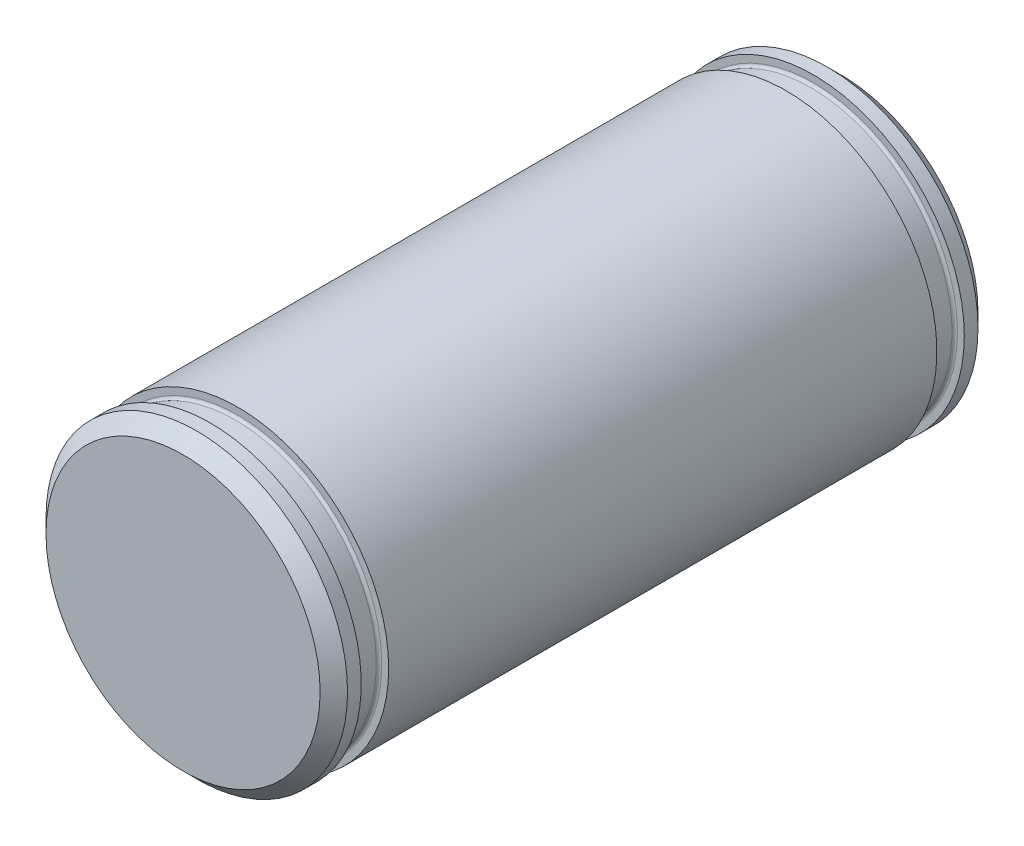
ISO-10303-21;
HEADER;
FILE_DESCRIPTION(('STEP AP214'),'2;1');
FILE_NAME('part.step','',(''),(''),'','','');
FILE_SCHEMA(('AUTOMOTIVE_DESIGN { 1 0 10303 214 1 1 1 1 }'));
ENDSEC;
DATA;
#1=APPLICATION_CONTEXT('core data for automotive mechanical design processes');
#2=APPLICATION_PROTOCOL_DEFINITION('international standard','automotive_design',2000,#1);
#3=PRODUCT_CONTEXT('',#1,'mechanical');
#4=PRODUCT('Part','Part','',(#3));
#5=PRODUCT_RELATED_PRODUCT_CATEGORY('part','',(#4));
#6=PRODUCT_DEFINITION_FORMATION('','',#4);
#7=PRODUCT_DEFINITION_CONTEXT('part definition',#1,'design');
#8=PRODUCT_DEFINITION('design','',#6,#7);
#9=PRODUCT_DEFINITION_SHAPE('','',#8);
#10=(LENGTH_UNIT() NAMED_UNIT(*) SI_UNIT(.MILLI.,.METRE.));
#11=(NAMED_UNIT(*) PLANE_ANGLE_UNIT() SI_UNIT($,.RADIAN.));
#12=(NAMED_UNIT(*) SI_UNIT($,.STERADIAN.) SOLID_ANGLE_UNIT());
#13=UNCERTAINTY_MEASURE_WITH_UNIT(LENGTH_MEASURE(1.E-05),#10,'distance_accuracy_value','');
#14=(GEOMETRIC_REPRESENTATION_CONTEXT(3) GLOBAL_UNCERTAINTY_ASSIGNED_CONTEXT((#13)) GLOBAL_UNIT_ASSIGNED_CONTEXT((#10,
#11,#12)) REPRESENTATION_CONTEXT('',''));
#15=CARTESIAN_POINT('',(0.,0.,0.));
#16=DIRECTION('',(0.,0.,1.));
#17=DIRECTION('',(1.,0.,0.));
#18=AXIS2_PLACEMENT_3D('',#15,#16,#17);
#19=CARTESIAN_POINT('',(0.,0.,12.));
#20=DIRECTION('',(0.,0.,-1.));
#21=DIRECTION('',(-1.,0.,0.));
#22=AXIS2_PLACEMENT_3D('',#19,#20,#21);
#23=CYLINDRICAL_SURFACE('',#22,5.5);
#24=CARTESIAN_POINT('',(0.,0.,10.));
#25=DIRECTION('',(0.,0.,1.));
#26=DIRECTION('',(1.,0.,0.));
#27=AXIS2_PLACEMENT_3D('',#24,#25,#26);
#28=CIRCLE('',#27,5.5);
#29=CARTESIAN_POINT('',(5.5,0.,10.));
#30=VERTEX_POINT('',#29);
#31=EDGE_CURVE('E46',#30,#30,#28,.T.);
#32=ORIENTED_EDGE('',*,*,#31,.F.);
#33=EDGE_LOOP('',(#32));
#34=FACE_BOUND('',#33,.T.);
#35=CARTESIAN_POINT('',(0.,0.,-10.));
#36=DIRECTION('',(0.,0.,-1.));
#37=DIRECTION('',(-1.,0.,0.));
#38=AXIS2_PLACEMENT_3D('',#35,#36,#37);
#39=CIRCLE('',#38,5.5);
#40=CARTESIAN_POINT('',(-5.5,0.,-10.));
#41=VERTEX_POINT('',#40);
#42=EDGE_CURVE('E53',#41,#41,#39,.T.);
#43=ORIENTED_EDGE('',*,*,#42,.F.);
#44=EDGE_LOOP('',(#43));
#45=FACE_BOUND('',#44,.T.);
#46=ADVANCED_FACE('F29',(#34,#45),#23,.T.);
#47=CARTESIAN_POINT('',(0.,0.,11.5));
#48=DIRECTION('',(0.,0.,1.));
#49=DIRECTION('',(1.,0.,0.));
#50=AXIS2_PLACEMENT_3D('',#47,#48,#49);
#51=CIRCLE('',#50,5.5);
#52=CARTESIAN_POINT('',(5.5,0.,11.5));
#53=VERTEX_POINT('',#52);
#54=EDGE_CURVE('E42',#53,#53,#51,.F.);
#55=ORIENTED_EDGE('',*,*,#54,.T.);
#56=EDGE_LOOP('',(#55));
#57=FACE_BOUND('',#56,.T.);
#58=CARTESIAN_POINT('',(0.,0.,11.));
#59=DIRECTION('',(0.,0.,-1.));
#60=DIRECTION('',(-1.,0.,0.));
#61=AXIS2_PLACEMENT_3D('',#58,#59,#60);
#62=CIRCLE('',#61,5.5);
#63=CARTESIAN_POINT('',(-5.5,0.,11.));
#64=VERTEX_POINT('',#63);
#65=EDGE_CURVE('E49',#64,#64,#62,.T.);
#66=ORIENTED_EDGE('',*,*,#65,.F.);
#67=EDGE_LOOP('',(#66));
#68=FACE_BOUND('',#67,.T.);
#69=ADVANCED_FACE('F84',(#57,#68),#23,.T.);
#70=CARTESIAN_POINT('',(0.,0.,12.));
#71=DIRECTION('',(0.,0.,1.));
#72=DIRECTION('',(1.,0.,0.));
#73=AXIS2_PLACEMENT_3D('',#70,#71,#72);
#74=PLANE('',#73);
#75=CARTESIAN_POINT('',(0.,0.,12.));
#76=DIRECTION('',(0.,0.,1.));
#77=DIRECTION('',(1.,0.,0.));
#78=AXIS2_PLACEMENT_3D('',#75,#76,#77);
#79=CIRCLE('',#78,5.);
#80=CARTESIAN_POINT('',(5.,0.,12.));
#81=VERTEX_POINT('',#80);
#82=EDGE_CURVE('E52',#81,#81,#79,.T.);
#83=ORIENTED_EDGE('',*,*,#82,.T.);
#84=EDGE_LOOP('',(#83));
#85=FACE_BOUND('',#84,.T.);
#86=ADVANCED_FACE('F91',(#85),#74,.T.);
#87=CARTESIAN_POINT('',(0.,0.,12.));
#88=DIRECTION('',(0.,0.,-1.));
#89=DIRECTION('',(-1.,0.,0.));
#90=AXIS2_PLACEMENT_3D('',#87,#88,#89);
#91=CONICAL_SURFACE('',#90,5.,0.785398163397447);
#92=ORIENTED_EDGE('',*,*,#54,.F.);
#93=EDGE_LOOP('',(#92));
#94=FACE_BOUND('',#93,.T.);
#95=ORIENTED_EDGE('',*,*,#82,.F.);
#96=EDGE_LOOP('',(#95));
#97=FACE_BOUND('',#96,.T.);
#98=ADVANCED_FACE('F87',(#94,#97),#91,.T.);
#99=CARTESIAN_POINT('',(0.,5.25,11.));
#100=DIRECTION('',(0.,0.,-1.));
#101=DIRECTION('',(-1.,0.,0.));
#102=AXIS2_PLACEMENT_3D('',#99,#100,#101);
#103=PLANE('',#102);
#104=CARTESIAN_POINT('',(0.,0.,11.));
#105=DIRECTION('',(0.,0.,-1.));
#106=DIRECTION('',(-1.,0.,0.));
#107=AXIS2_PLACEMENT_3D('',#104,#105,#106);
#108=CIRCLE('',#107,5.25);
#109=CARTESIAN_POINT('',(-5.25,0.,11.));
#110=VERTEX_POINT('',#109);
#111=EDGE_CURVE('E50',#110,#110,#108,.T.);
#112=ORIENTED_EDGE('',*,*,#111,.F.);
#113=EDGE_LOOP('',(#112));
#114=FACE_BOUND('',#113,.T.);
#115=ORIENTED_EDGE('',*,*,#65,.T.);
#116=EDGE_LOOP('',(#115));
#117=FACE_BOUND('',#116,.T.);
#118=ADVANCED_FACE('F90',(#114,#117),#103,.T.);
#119=CARTESIAN_POINT('',(0.,6.6,10.));
#120=DIRECTION('',(0.,0.,1.));
#121=DIRECTION('',(1.,0.,0.));
#122=AXIS2_PLACEMENT_3D('',#119,#120,#121);
#123=PLANE('',#122);
#124=CARTESIAN_POINT('',(0.,0.,9.99999999999999));
#125=DIRECTION('',(0.,0.,-1.));
#126=DIRECTION('',(-1.,0.,0.));
#127=AXIS2_PLACEMENT_3D('',#124,#125,#126);
#128=CIRCLE('',#127,5.25);
#129=CARTESIAN_POINT('',(-5.25,0.,9.99999999999999));
#130=VERTEX_POINT('',#129);
#131=EDGE_CURVE('E59',#130,#130,#128,.T.);
#132=ORIENTED_EDGE('',*,*,#131,.T.);
#133=EDGE_LOOP('',(#132));
#134=FACE_BOUND('',#133,.T.);
#135=ORIENTED_EDGE('',*,*,#31,.T.);
#136=EDGE_LOOP('',(#135));
#137=FACE_BOUND('',#136,.T.);
#138=ADVANCED_FACE('F138',(#134,#137),#123,.T.);
#139=CARTESIAN_POINT('',(0.,0.,10.9));
#140=DIRECTION('',(0.,0.,-1.));
#141=DIRECTION('',(-1.,0.,0.));
#142=AXIS2_PLACEMENT_3D('',#139,#140,#141);
#143=TOROIDAL_SURFACE('',#142,5.25,0.0999999999999994);
#144=ORIENTED_EDGE('',*,*,#111,.T.);
#145=EDGE_LOOP('',(#144));
#146=FACE_BOUND('',#145,.T.);
#147=CARTESIAN_POINT('',(0.,0.,10.9));
#148=DIRECTION('',(0.,0.,-1.));
#149=DIRECTION('',(-1.,0.,0.));
#150=AXIS2_PLACEMENT_3D('',#147,#148,#149);
#151=CIRCLE('',#150,5.15);
#152=CARTESIAN_POINT('',(-5.15,0.,10.9));
#153=VERTEX_POINT('',#152);
#154=EDGE_CURVE('E75',#153,#153,#151,.T.);
#155=ORIENTED_EDGE('',*,*,#154,.F.);
#156=EDGE_LOOP('',(#155));
#157=FACE_BOUND('',#156,.T.);
#158=ADVANCED_FACE('F140',(#146,#157),#143,.F.);
#159=CARTESIAN_POINT('',(0.,0.,74.));
#160=DIRECTION('',(0.,0.,-1.));
#161=DIRECTION('',(-1.,0.,0.));
#162=AXIS2_PLACEMENT_3D('',#159,#160,#161);
#163=CYLINDRICAL_SURFACE('',#162,5.15);
#164=ORIENTED_EDGE('',*,*,#154,.T.);
#165=EDGE_LOOP('',(#164));
#166=FACE_BOUND('',#165,.T.);
#167=CARTESIAN_POINT('',(0.,0.,10.1));
#168=DIRECTION('',(0.,0.,-1.));
#169=DIRECTION('',(-1.,0.,0.));
#170=AXIS2_PLACEMENT_3D('',#167,#168,#169);
#171=CIRCLE('',#170,5.15);
#172=CARTESIAN_POINT('',(-5.15,0.,10.1));
#173=VERTEX_POINT('',#172);
#174=EDGE_CURVE('E72',#173,#173,#171,.T.);
#175=ORIENTED_EDGE('',*,*,#174,.F.);
#176=EDGE_LOOP('',(#175));
#177=FACE_BOUND('',#176,.T.);
#178=ADVANCED_FACE('F132',(#166,#177),#163,.T.);
#179=CARTESIAN_POINT('',(0.,0.,10.1));
#180=DIRECTION('',(0.,0.,-1.));
#181=DIRECTION('',(-1.,0.,0.));
#182=AXIS2_PLACEMENT_3D('',#179,#180,#181);
#183=TOROIDAL_SURFACE('',#182,5.25,0.0999999999999998);
#184=ORIENTED_EDGE('',*,*,#174,.T.);
#185=EDGE_LOOP('',(#184));
#186=FACE_BOUND('',#185,.T.);
#187=ORIENTED_EDGE('',*,*,#131,.F.);
#188=EDGE_LOOP('',(#187));
#189=FACE_BOUND('',#188,.T.);
#190=ADVANCED_FACE('F123',(#186,#189),#183,.F.);
#191=CARTESIAN_POINT('',(0.,5.25,-11.));
#192=DIRECTION('',(0.,0.,1.));
#193=DIRECTION('',(-1.,0.,0.));
#194=AXIS2_PLACEMENT_3D('',#191,#192,#193);
#195=PLANE('',#194);
#196=CARTESIAN_POINT('',(0.,0.,-11.));
#197=DIRECTION('',(0.,0.,-1.));
#198=DIRECTION('',(-1.,0.,0.));
#199=AXIS2_PLACEMENT_3D('',#196,#197,#198);
#200=CIRCLE('',#199,5.25);
#201=CARTESIAN_POINT('',(-5.25,0.,-11.));
#202=VERTEX_POINT('',#201);
#203=EDGE_CURVE('E55',#202,#202,#200,.T.);
#204=ORIENTED_EDGE('',*,*,#203,.T.);
#205=EDGE_LOOP('',(#204));
#206=FACE_BOUND('',#205,.T.);
#207=CARTESIAN_POINT('',(0.,0.,-11.));
#208=DIRECTION('',(0.,0.,1.));
#209=DIRECTION('',(1.,0.,0.));
#210=AXIS2_PLACEMENT_3D('',#207,#208,#209);
#211=CIRCLE('',#210,5.5);
#212=CARTESIAN_POINT('',(5.5,0.,-11.));
#213=VERTEX_POINT('',#212);
#214=EDGE_CURVE('E33',#213,#213,#211,.T.);
#215=ORIENTED_EDGE('',*,*,#214,.T.);
#216=EDGE_LOOP('',(#215));
#217=FACE_BOUND('',#216,.T.);
#218=ADVANCED_FACE('F120',(#206,#217),#195,.T.);
#219=CARTESIAN_POINT('',(0.,6.6,-10.));
#220=DIRECTION('',(0.,0.,-1.));
#221=DIRECTION('',(1.,0.,0.));
#222=AXIS2_PLACEMENT_3D('',#219,#220,#221);
#223=PLANE('',#222);
#224=CARTESIAN_POINT('',(0.,0.,-9.99999999999999));
#225=DIRECTION('',(0.,0.,-1.));
#226=DIRECTION('',(-1.,0.,0.));
#227=AXIS2_PLACEMENT_3D('',#224,#225,#226);
#228=CIRCLE('',#227,5.25);
#229=CARTESIAN_POINT('',(-5.25,0.,-9.99999999999999));
#230=VERTEX_POINT('',#229);
#231=EDGE_CURVE('E269',#230,#230,#228,.T.);
#232=ORIENTED_EDGE('',*,*,#231,.F.);
#233=EDGE_LOOP('',(#232));
#234=FACE_BOUND('',#233,.T.);
#235=ORIENTED_EDGE('',*,*,#42,.T.);
#236=EDGE_LOOP('',(#235));
#237=FACE_BOUND('',#236,.T.);
#238=ADVANCED_FACE('F122',(#234,#237),#223,.T.);
#239=CARTESIAN_POINT('',(0.,0.,-10.9));
#240=DIRECTION('',(0.,0.,1.));
#241=DIRECTION('',(-1.,0.,0.));
#242=AXIS2_PLACEMENT_3D('',#239,#240,#241);
#243=TOROIDAL_SURFACE('',#242,5.25,0.0999999999999994);
#244=ORIENTED_EDGE('',*,*,#203,.F.);
#245=EDGE_LOOP('',(#244));
#246=FACE_BOUND('',#245,.T.);
#247=CARTESIAN_POINT('',(0.,0.,-10.9));
#248=DIRECTION('',(0.,0.,-1.));
#249=DIRECTION('',(-1.,0.,0.));
#250=AXIS2_PLACEMENT_3D('',#247,#248,#249);
#251=CIRCLE('',#250,5.15);
#252=CARTESIAN_POINT('',(-5.15,0.,-10.9));
#253=VERTEX_POINT('',#252);
#254=EDGE_CURVE('E61',#253,#253,#251,.T.);
#255=ORIENTED_EDGE('',*,*,#254,.T.);
#256=EDGE_LOOP('',(#255));
#257=FACE_BOUND('',#256,.T.);
#258=ADVANCED_FACE('F129',(#246,#257),#243,.F.);
#259=CARTESIAN_POINT('',(0.,0.,-74.));
#260=DIRECTION('',(0.,0.,1.));
#261=DIRECTION('',(-1.,0.,0.));
#262=AXIS2_PLACEMENT_3D('',#259,#260,#261);
#263=CYLINDRICAL_SURFACE('',#262,5.15);
#264=ORIENTED_EDGE('',*,*,#254,.F.);
#265=EDGE_LOOP('',(#264));
#266=FACE_BOUND('',#265,.T.);
#267=CARTESIAN_POINT('',(0.,0.,-10.1));
#268=DIRECTION('',(0.,0.,-1.));
#269=DIRECTION('',(-1.,0.,0.));
#270=AXIS2_PLACEMENT_3D('',#267,#268,#269);
#271=CIRCLE('',#270,5.15);
#272=CARTESIAN_POINT('',(-5.15,0.,-10.1));
#273=VERTEX_POINT('',#272);
#274=EDGE_CURVE('E66',#273,#273,#271,.T.);
#275=ORIENTED_EDGE('',*,*,#274,.T.);
#276=EDGE_LOOP('',(#275));
#277=FACE_BOUND('',#276,.T.);
#278=ADVANCED_FACE('F205',(#266,#277),#263,.T.);
#279=CARTESIAN_POINT('',(0.,0.,-10.1));
#280=DIRECTION('',(0.,0.,1.));
#281=DIRECTION('',(-1.,0.,0.));
#282=AXIS2_PLACEMENT_3D('',#279,#280,#281);
#283=TOROIDAL_SURFACE('',#282,5.25,0.0999999999999998);
#284=ORIENTED_EDGE('',*,*,#274,.F.);
#285=EDGE_LOOP('',(#284));
#286=FACE_BOUND('',#285,.T.);
#287=ORIENTED_EDGE('',*,*,#231,.T.);
#288=EDGE_LOOP('',(#287));
#289=FACE_BOUND('',#288,.T.);
#290=ADVANCED_FACE('F214',(#286,#289),#283,.F.);
#291=CARTESIAN_POINT('',(0.,0.,-12.));
#292=DIRECTION('',(0.,0.,1.));
#293=DIRECTION('',(1.,0.,0.));
#294=AXIS2_PLACEMENT_3D('',#291,#292,#293);
#295=PLANE('',#294);
#296=CARTESIAN_POINT('',(0.,0.,-12.));
#297=DIRECTION('',(0.,0.,1.));
#298=DIRECTION('',(1.,0.,0.));
#299=AXIS2_PLACEMENT_3D('',#296,#297,#298);
#300=CIRCLE('',#299,5.);
#301=CARTESIAN_POINT('',(5.,0.,-12.));
#302=VERTEX_POINT('',#301);
#303=EDGE_CURVE('E10',#302,#302,#300,.F.);
#304=ORIENTED_EDGE('',*,*,#303,.T.);
#305=EDGE_LOOP('',(#304));
#306=FACE_BOUND('',#305,.T.);
#307=ADVANCED_FACE('F114',(#306),#295,.F.);
#308=CARTESIAN_POINT('',(0.,0.,-11.5));
#309=DIRECTION('',(0.,0.,1.));
#310=DIRECTION('',(1.,0.,0.));
#311=AXIS2_PLACEMENT_3D('',#308,#309,#310);
#312=CONICAL_SURFACE('',#311,5.5,0.785398163397452);
#313=ORIENTED_EDGE('',*,*,#303,.F.);
#314=EDGE_LOOP('',(#313));
#315=FACE_BOUND('',#314,.T.);
#316=CARTESIAN_POINT('',(0.,0.,-11.5));
#317=DIRECTION('',(0.,0.,1.));
#318=DIRECTION('',(1.,0.,0.));
#319=AXIS2_PLACEMENT_3D('',#316,#317,#318);
#320=CIRCLE('',#319,5.5);
#321=CARTESIAN_POINT('',(5.5,0.,-11.5));
#322=VERTEX_POINT('',#321);
#323=EDGE_CURVE('E37',#322,#322,#320,.T.);
#324=ORIENTED_EDGE('',*,*,#323,.F.);
#325=EDGE_LOOP('',(#324));
#326=FACE_BOUND('',#325,.T.);
#327=ADVANCED_FACE('F31',(#315,#326),#312,.T.);
#328=ORIENTED_EDGE('',*,*,#323,.T.);
#329=EDGE_LOOP('',(#328));
#330=FACE_BOUND('',#329,.T.);
#331=ORIENTED_EDGE('',*,*,#214,.F.);
#332=EDGE_LOOP('',(#331));
#333=FACE_BOUND('',#332,.T.);
#334=ADVANCED_FACE('F100',(#330,#333),#23,.T.);
#335=CLOSED_SHELL('',(#46,#69,#86,#98,#118,#138,#158,#178,#190,#218,#238,#258,#278,#290,#307,
#327,#334));
#336=MANIFOLD_SOLID_BREP('B2',#335);
#337=ADVANCED_BREP_SHAPE_REPRESENTATION('',(#18,#336),#14);
#338=SHAPE_DEFINITION_REPRESENTATION(#9,#337);
ENDSEC;
END-ISO-10303-21;
